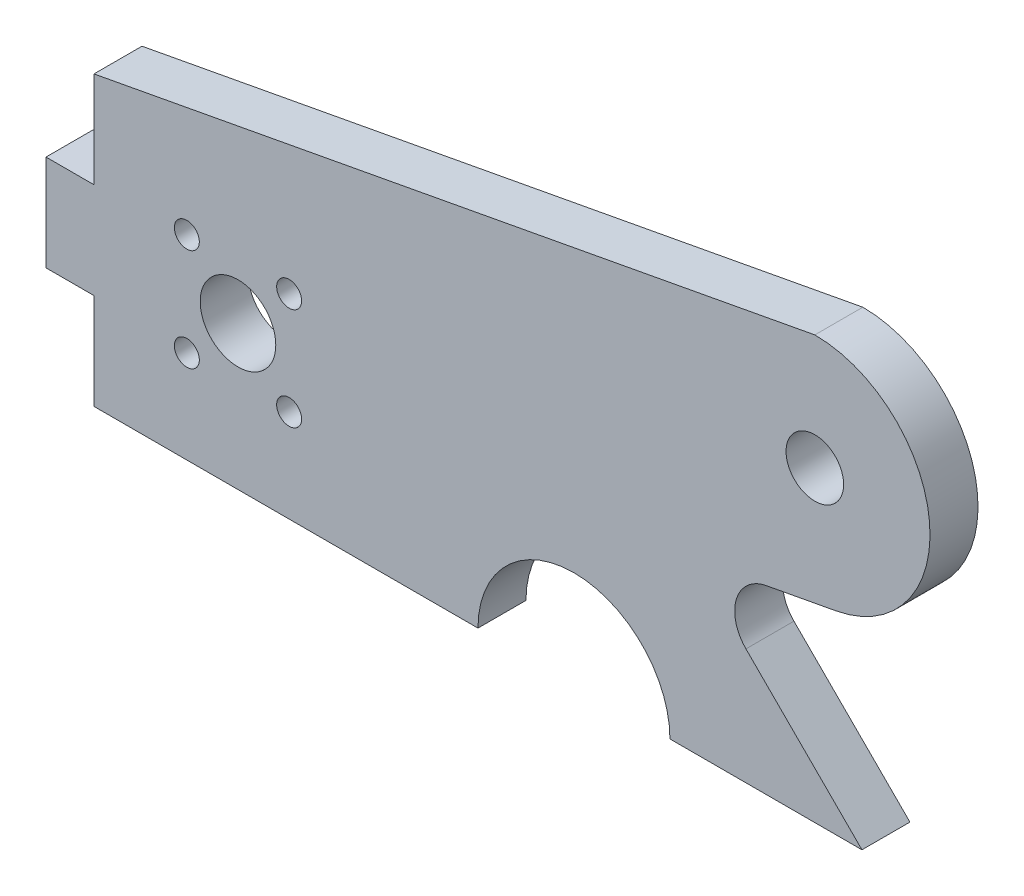
ISO-10303-21;
HEADER;
FILE_DESCRIPTION(('STEP AP214'),'2;1');
FILE_NAME('part.step','',(''),(''),'','','');
FILE_SCHEMA(('AUTOMOTIVE_DESIGN { 1 0 10303 214 1 1 1 1 }'));
ENDSEC;
DATA;
#1=APPLICATION_CONTEXT('core data for automotive mechanical design processes');
#2=APPLICATION_PROTOCOL_DEFINITION('international standard','automotive_design',2000,#1);
#3=PRODUCT_CONTEXT('',#1,'mechanical');
#4=PRODUCT('Part','Part','',(#3));
#5=PRODUCT_RELATED_PRODUCT_CATEGORY('part','',(#4));
#6=PRODUCT_DEFINITION_FORMATION('','',#4);
#7=PRODUCT_DEFINITION_CONTEXT('part definition',#1,'design');
#8=PRODUCT_DEFINITION('design','',#6,#7);
#9=PRODUCT_DEFINITION_SHAPE('','',#8);
#10=(LENGTH_UNIT() NAMED_UNIT(*) SI_UNIT(.MILLI.,.METRE.));
#11=(NAMED_UNIT(*) PLANE_ANGLE_UNIT() SI_UNIT($,.RADIAN.));
#12=(NAMED_UNIT(*) SI_UNIT($,.STERADIAN.) SOLID_ANGLE_UNIT());
#13=UNCERTAINTY_MEASURE_WITH_UNIT(LENGTH_MEASURE(1.E-05),#10,'distance_accuracy_value','');
#14=(GEOMETRIC_REPRESENTATION_CONTEXT(3) GLOBAL_UNCERTAINTY_ASSIGNED_CONTEXT((#13)) GLOBAL_UNIT_ASSIGNED_CONTEXT((#10,
#11,#12)) REPRESENTATION_CONTEXT('',''));
#15=CARTESIAN_POINT('',(0.,0.,0.));
#16=DIRECTION('',(0.,0.,1.));
#17=DIRECTION('',(1.,0.,0.));
#18=AXIS2_PLACEMENT_3D('',#15,#16,#17);
#19=CARTESIAN_POINT('',(0.,0.,6.35));
#20=DIRECTION('',(0.,1.,0.));
#21=DIRECTION('',(-1.,0.,0.));
#22=AXIS2_PLACEMENT_3D('',#19,#20,#21);
#23=PLANE('',#22);
#24=DIRECTION('',(1.,0.,0.));
#25=VECTOR('',#24,1.);
#26=CARTESIAN_POINT('',(0.,0.,0.));
#27=LINE('',#26,#25);
#28=CARTESIAN_POINT('',(0.,0.,0.));
#29=VERTEX_POINT('',#28);
#30=CARTESIAN_POINT('',(50.8,0.,0.));
#31=VERTEX_POINT('',#30);
#32=EDGE_CURVE('E142',#29,#31,#27,.T.);
#33=ORIENTED_EDGE('',*,*,#32,.T.);
#34=DIRECTION('',(0.,0.,1.));
#35=VECTOR('',#34,1.);
#36=CARTESIAN_POINT('',(50.8,0.,0.));
#37=LINE('',#36,#35);
#38=CARTESIAN_POINT('',(50.8,0.,6.35));
#39=VERTEX_POINT('',#38);
#40=EDGE_CURVE('E128',#31,#39,#37,.T.);
#41=ORIENTED_EDGE('',*,*,#40,.T.);
#42=DIRECTION('',(1.,0.,0.));
#43=VECTOR('',#42,1.);
#44=CARTESIAN_POINT('',(0.,0.,6.35));
#45=LINE('',#44,#43);
#46=CARTESIAN_POINT('',(0.,0.,6.35));
#47=VERTEX_POINT('',#46);
#48=EDGE_CURVE('E222',#47,#39,#45,.T.);
#49=ORIENTED_EDGE('',*,*,#48,.F.);
#50=DIRECTION('',(0.,0.,-1.));
#51=VECTOR('',#50,1.);
#52=CARTESIAN_POINT('',(0.,0.,6.35));
#53=LINE('',#52,#51);
#54=EDGE_CURVE('E148',#47,#29,#53,.T.);
#55=ORIENTED_EDGE('',*,*,#54,.T.);
#56=EDGE_LOOP('',(#33,#41,#49,#55));
#57=FACE_BOUND('',#56,.T.);
#58=ADVANCED_FACE('F34',(#57),#23,.F.);
#59=CARTESIAN_POINT('',(95.3674532925549,40.64,6.35));
#60=DIRECTION('',(0.,0.,1.));
#61=DIRECTION('',(1.,0.,0.));
#62=AXIS2_PLACEMENT_3D('',#59,#60,#61);
#63=PLANE('',#62);
#64=CARTESIAN_POINT('',(19.05,19.05,6.35));
#65=DIRECTION('',(0.,0.,1.));
#66=DIRECTION('',(1.,0.,0.));
#67=AXIS2_PLACEMENT_3D('',#64,#65,#66);
#68=CIRCLE('',#67,5.000000033);
#69=CARTESIAN_POINT('',(24.050000033,19.05,6.35));
#70=VERTEX_POINT('',#69);
#71=EDGE_CURVE('E458',#70,#70,#68,.T.);
#72=ORIENTED_EDGE('',*,*,#71,.F.);
#73=EDGE_LOOP('',(#72));
#74=FACE_BOUND('',#73,.T.);
#75=CARTESIAN_POINT('',(63.5,0.,6.35));
#76=DIRECTION('',(0.,0.,1.));
#77=DIRECTION('',(1.,0.,0.));
#78=AXIS2_PLACEMENT_3D('',#75,#76,#77);
#79=CIRCLE('',#78,12.7);
#80=CARTESIAN_POINT('',(76.2,0.,6.35));
#81=VERTEX_POINT('',#80);
#82=EDGE_CURVE('E131',#81,#39,#79,.T.);
#83=ORIENTED_EDGE('',*,*,#82,.F.);
#84=CARTESIAN_POINT('',(101.6,0.,6.35));
#85=VERTEX_POINT('',#84);
#86=EDGE_CURVE('E243',#81,#85,#45,.T.);
#87=ORIENTED_EDGE('',*,*,#86,.T.);
#88=DIRECTION('',(-0.707106781186551,0.707106781186544,0.));
#89=VECTOR('',#88,1.);
#90=CARTESIAN_POINT('',(101.6,0.,6.35));
#91=LINE('',#90,#89);
#92=CARTESIAN_POINT('',(86.2519913059842,15.3480086940156,6.35));
#93=VERTEX_POINT('',#92);
#94=EDGE_CURVE('E214',#85,#93,#91,.T.);
#95=ORIENTED_EDGE('',*,*,#94,.T.);
#96=CARTESIAN_POINT('',(89.8440937544119,18.9401111424433,6.35));
#97=DIRECTION('',(0.,0.,1.));
#98=DIRECTION('',(1.,0.,0.));
#99=AXIS2_PLACEMENT_3D('',#96,#97,#98);
#100=CIRCLE('',#99,5.08);
#101=CARTESIAN_POINT('',(88.913037875358,23.934060977001,6.35));
#102=VERTEX_POINT('',#101);
#103=EDGE_CURVE('E11',#93,#102,#100,.F.);
#104=ORIENTED_EDGE('',*,*,#103,.T.);
#105=DIRECTION('',(0.983060991054671,0.183278716349196,0.));
#106=VECTOR('',#105,1.);
#107=CARTESIAN_POINT('',(79.4333090501251,22.1666909498746,6.35));
#108=LINE('',#107,#106);
#109=CARTESIAN_POINT('',(98.1606209297166,25.6581504963268,6.35));
#110=VERTEX_POINT('',#109);
#111=EDGE_CURVE('E212',#102,#110,#108,.T.);
#112=ORIENTED_EDGE('',*,*,#111,.T.);
#113=CARTESIAN_POINT('',(95.3674532925549,40.64,6.35));
#114=DIRECTION('',(0.,0.,1.));
#115=DIRECTION('',(1.,0.,0.));
#116=AXIS2_PLACEMENT_3D('',#113,#114,#115);
#117=CIRCLE('',#116,15.24);
#118=CARTESIAN_POINT('',(95.3674532925549,55.88,6.35));
#119=VERTEX_POINT('',#118);
#120=EDGE_CURVE('E218',#110,#119,#117,.T.);
#121=ORIENTED_EDGE('',*,*,#120,.T.);
#122=DIRECTION('',(-0.983060991054669,-0.183278716349203,0.));
#123=VECTOR('',#122,1.);
#124=CARTESIAN_POINT('',(95.3674532925549,55.88,6.35));
#125=LINE('',#124,#123);
#126=CARTESIAN_POINT('',(0.,38.1,6.35));
#127=VERTEX_POINT('',#126);
#128=EDGE_CURVE('E220',#119,#127,#125,.T.);
#129=ORIENTED_EDGE('',*,*,#128,.T.);
#130=DIRECTION('',(0.,-1.,0.));
#131=VECTOR('',#130,1.);
#132=CARTESIAN_POINT('',(0.,38.1,6.35));
#133=LINE('',#132,#131);
#134=CARTESIAN_POINT('',(0.,25.4,6.35));
#135=VERTEX_POINT('',#134);
#136=EDGE_CURVE('E227',#127,#135,#133,.T.);
#137=ORIENTED_EDGE('',*,*,#136,.T.);
#138=DIRECTION('',(-1.,0.,0.));
#139=VECTOR('',#138,1.);
#140=CARTESIAN_POINT('',(0.,25.4,6.35));
#141=LINE('',#140,#139);
#142=CARTESIAN_POINT('',(-6.35,25.4,6.35));
#143=VERTEX_POINT('',#142);
#144=EDGE_CURVE('E229',#135,#143,#141,.T.);
#145=ORIENTED_EDGE('',*,*,#144,.T.);
#146=DIRECTION('',(0.,-1.,0.));
#147=VECTOR('',#146,1.);
#148=CARTESIAN_POINT('',(-6.35,25.4,6.35));
#149=LINE('',#148,#147);
#150=CARTESIAN_POINT('',(-6.35,12.7,6.35));
#151=VERTEX_POINT('',#150);
#152=EDGE_CURVE('E231',#143,#151,#149,.T.);
#153=ORIENTED_EDGE('',*,*,#152,.T.);
#154=DIRECTION('',(1.,0.,0.));
#155=VECTOR('',#154,1.);
#156=CARTESIAN_POINT('',(0.,12.7,6.35));
#157=LINE('',#156,#155);
#158=CARTESIAN_POINT('',(0.,12.7,6.35));
#159=VERTEX_POINT('',#158);
#160=EDGE_CURVE('E176',#151,#159,#157,.T.);
#161=ORIENTED_EDGE('',*,*,#160,.T.);
#162=DIRECTION('',(0.,-1.,0.));
#163=VECTOR('',#162,1.);
#164=CARTESIAN_POINT('',(0.,12.7,6.35));
#165=LINE('',#164,#163);
#166=EDGE_CURVE('E171',#159,#47,#165,.T.);
#167=ORIENTED_EDGE('',*,*,#166,.T.);
#168=ORIENTED_EDGE('',*,*,#48,.T.);
#169=EDGE_LOOP('',(#83,#87,#95,#104,#112,#121,#129,#137,#145,#153,#161,#167,#168));
#170=FACE_BOUND('',#169,.T.);
#171=CARTESIAN_POINT('',(12.2829881040447,12.2829881040447,6.35));
#172=DIRECTION('',(0.,0.,1.));
#173=DIRECTION('',(1.,0.,0.));
#174=AXIS2_PLACEMENT_3D('',#171,#172,#173);
#175=CIRCLE('',#174,1.65099999999998);
#176=CARTESIAN_POINT('',(13.9339881040447,12.2829881040447,6.35));
#177=VERTEX_POINT('',#176);
#178=EDGE_CURVE('E274',#177,#177,#175,.T.);
#179=ORIENTED_EDGE('',*,*,#178,.F.);
#180=EDGE_LOOP('',(#179));
#181=FACE_BOUND('',#180,.T.);
#182=CARTESIAN_POINT('',(25.8170118959553,25.8170118959552,6.35));
#183=DIRECTION('',(0.,0.,1.));
#184=DIRECTION('',(1.,0.,0.));
#185=AXIS2_PLACEMENT_3D('',#182,#183,#184);
#186=CIRCLE('',#185,1.65099999999998);
#187=CARTESIAN_POINT('',(27.4680118959552,25.8170118959552,6.35));
#188=VERTEX_POINT('',#187);
#189=EDGE_CURVE('E286',#188,#188,#186,.T.);
#190=ORIENTED_EDGE('',*,*,#189,.F.);
#191=EDGE_LOOP('',(#190));
#192=FACE_BOUND('',#191,.T.);
#193=CARTESIAN_POINT('',(95.3674532925549,40.64,6.35));
#194=DIRECTION('',(0.,0.,1.));
#195=DIRECTION('',(1.,0.,0.));
#196=AXIS2_PLACEMENT_3D('',#193,#194,#195);
#197=CIRCLE('',#196,3.81000000000002);
#198=CARTESIAN_POINT('',(99.1774532925549,40.64,6.35));
#199=VERTEX_POINT('',#198);
#200=EDGE_CURVE('E290',#199,#199,#197,.T.);
#201=ORIENTED_EDGE('',*,*,#200,.F.);
#202=EDGE_LOOP('',(#201));
#203=FACE_BOUND('',#202,.T.);
#204=CARTESIAN_POINT('',(25.8170118959553,12.2829881040447,6.35));
#205=DIRECTION('',(0.,0.,1.));
#206=DIRECTION('',(1.,0.,0.));
#207=AXIS2_PLACEMENT_3D('',#204,#205,#206);
#208=CIRCLE('',#207,1.65099999999998);
#209=CARTESIAN_POINT('',(27.4680118959552,12.2829881040447,6.35));
#210=VERTEX_POINT('',#209);
#211=EDGE_CURVE('E280',#210,#210,#208,.T.);
#212=ORIENTED_EDGE('',*,*,#211,.F.);
#213=EDGE_LOOP('',(#212));
#214=FACE_BOUND('',#213,.T.);
#215=CARTESIAN_POINT('',(12.2829881040448,25.8170118959553,6.35));
#216=DIRECTION('',(0.,0.,1.));
#217=DIRECTION('',(1.,0.,0.));
#218=AXIS2_PLACEMENT_3D('',#215,#216,#217);
#219=CIRCLE('',#218,1.65099999999999);
#220=CARTESIAN_POINT('',(13.9339881040447,25.8170118959553,6.35));
#221=VERTEX_POINT('',#220);
#222=EDGE_CURVE('E268',#221,#221,#219,.T.);
#223=ORIENTED_EDGE('',*,*,#222,.F.);
#224=EDGE_LOOP('',(#223));
#225=FACE_BOUND('',#224,.T.);
#226=ADVANCED_FACE('F210',(#74,#170,#181,#192,#203,#214,#225),#63,.T.);
#227=CARTESIAN_POINT('',(95.3674532925549,40.64,0.));
#228=DIRECTION('',(0.,0.,1.));
#229=DIRECTION('',(1.,0.,0.));
#230=AXIS2_PLACEMENT_3D('',#227,#228,#229);
#231=PLANE('',#230);
#232=CARTESIAN_POINT('',(19.05,19.05,0.));
#233=DIRECTION('',(0.,0.,1.));
#234=DIRECTION('',(1.,0.,0.));
#235=AXIS2_PLACEMENT_3D('',#232,#233,#234);
#236=CIRCLE('',#235,5.000000033);
#237=CARTESIAN_POINT('',(24.050000033,19.05,0.));
#238=VERTEX_POINT('',#237);
#239=EDGE_CURVE('E249',#238,#238,#236,.T.);
#240=ORIENTED_EDGE('',*,*,#239,.T.);
#241=EDGE_LOOP('',(#240));
#242=FACE_BOUND('',#241,.T.);
#243=CARTESIAN_POINT('',(76.2,0.,0.));
#244=VERTEX_POINT('',#243);
#245=CARTESIAN_POINT('',(101.6,0.,0.));
#246=VERTEX_POINT('',#245);
#247=EDGE_CURVE('E145',#244,#246,#27,.T.);
#248=ORIENTED_EDGE('',*,*,#247,.F.);
#249=CARTESIAN_POINT('',(63.5,0.,0.));
#250=DIRECTION('',(0.,0.,1.));
#251=DIRECTION('',(1.,0.,0.));
#252=AXIS2_PLACEMENT_3D('',#249,#250,#251);
#253=CIRCLE('',#252,12.7);
#254=EDGE_CURVE('E49',#244,#31,#253,.T.);
#255=ORIENTED_EDGE('',*,*,#254,.T.);
#256=ORIENTED_EDGE('',*,*,#32,.F.);
#257=DIRECTION('',(0.,-1.,0.));
#258=VECTOR('',#257,1.);
#259=CARTESIAN_POINT('',(0.,12.7,0.));
#260=LINE('',#259,#258);
#261=CARTESIAN_POINT('',(0.,12.7,0.));
#262=VERTEX_POINT('',#261);
#263=EDGE_CURVE('E154',#262,#29,#260,.T.);
#264=ORIENTED_EDGE('',*,*,#263,.F.);
#265=DIRECTION('',(1.,0.,0.));
#266=VECTOR('',#265,1.);
#267=CARTESIAN_POINT('',(0.,12.7,0.));
#268=LINE('',#267,#266);
#269=CARTESIAN_POINT('',(-6.35,12.7,0.));
#270=VERTEX_POINT('',#269);
#271=EDGE_CURVE('E169',#270,#262,#268,.T.);
#272=ORIENTED_EDGE('',*,*,#271,.F.);
#273=DIRECTION('',(0.,-1.,0.));
#274=VECTOR('',#273,1.);
#275=CARTESIAN_POINT('',(-6.35,25.4,0.));
#276=LINE('',#275,#274);
#277=CARTESIAN_POINT('',(-6.35,25.4,0.));
#278=VERTEX_POINT('',#277);
#279=EDGE_CURVE('E167',#278,#270,#276,.T.);
#280=ORIENTED_EDGE('',*,*,#279,.F.);
#281=DIRECTION('',(-1.,0.,0.));
#282=VECTOR('',#281,1.);
#283=CARTESIAN_POINT('',(0.,25.4,0.));
#284=LINE('',#283,#282);
#285=CARTESIAN_POINT('',(0.,25.4,0.));
#286=VERTEX_POINT('',#285);
#287=EDGE_CURVE('E165',#286,#278,#284,.T.);
#288=ORIENTED_EDGE('',*,*,#287,.F.);
#289=DIRECTION('',(0.,-1.,0.));
#290=VECTOR('',#289,1.);
#291=CARTESIAN_POINT('',(0.,38.1,0.));
#292=LINE('',#291,#290);
#293=CARTESIAN_POINT('',(0.,38.1,0.));
#294=VERTEX_POINT('',#293);
#295=EDGE_CURVE('E163',#294,#286,#292,.T.);
#296=ORIENTED_EDGE('',*,*,#295,.F.);
#297=DIRECTION('',(-0.983060991054669,-0.183278716349203,0.));
#298=VECTOR('',#297,1.);
#299=CARTESIAN_POINT('',(95.3674532925549,55.88,0.));
#300=LINE('',#299,#298);
#301=CARTESIAN_POINT('',(95.3674532925549,55.88,0.));
#302=VERTEX_POINT('',#301);
#303=EDGE_CURVE('E161',#302,#294,#300,.T.);
#304=ORIENTED_EDGE('',*,*,#303,.F.);
#305=CARTESIAN_POINT('',(95.3674532925549,40.64,0.));
#306=DIRECTION('',(0.,0.,1.));
#307=DIRECTION('',(1.,0.,0.));
#308=AXIS2_PLACEMENT_3D('',#305,#306,#307);
#309=CIRCLE('',#308,15.24);
#310=CARTESIAN_POINT('',(98.1606209297166,25.6581504963268,0.));
#311=VERTEX_POINT('',#310);
#312=EDGE_CURVE('E159',#311,#302,#309,.T.);
#313=ORIENTED_EDGE('',*,*,#312,.F.);
#314=DIRECTION('',(0.983060991054671,0.183278716349196,0.));
#315=VECTOR('',#314,1.);
#316=CARTESIAN_POINT('',(79.4333090501251,22.1666909498746,0.));
#317=LINE('',#316,#315);
#318=CARTESIAN_POINT('',(88.913037875358,23.934060977001,0.));
#319=VERTEX_POINT('',#318);
#320=EDGE_CURVE('E152',#319,#311,#317,.T.);
#321=ORIENTED_EDGE('',*,*,#320,.F.);
#322=CARTESIAN_POINT('',(89.8440937544119,18.9401111424433,0.));
#323=DIRECTION('',(0.,0.,1.));
#324=DIRECTION('',(1.,0.,0.));
#325=AXIS2_PLACEMENT_3D('',#322,#323,#324);
#326=CIRCLE('',#325,5.08);
#327=CARTESIAN_POINT('',(86.2519913059842,15.3480086940156,0.));
#328=VERTEX_POINT('',#327);
#329=EDGE_CURVE('E42',#319,#328,#326,.T.);
#330=ORIENTED_EDGE('',*,*,#329,.T.);
#331=DIRECTION('',(-0.707106781186551,0.707106781186544,0.));
#332=VECTOR('',#331,1.);
#333=CARTESIAN_POINT('',(101.6,0.,0.));
#334=LINE('',#333,#332);
#335=EDGE_CURVE('E150',#246,#328,#334,.T.);
#336=ORIENTED_EDGE('',*,*,#335,.F.);
#337=EDGE_LOOP('',(#248,#255,#256,#264,#272,#280,#288,#296,#304,#313,#321,#330,#336));
#338=FACE_BOUND('',#337,.T.);
#339=CARTESIAN_POINT('',(95.3674532925549,40.64,0.));
#340=DIRECTION('',(0.,0.,1.));
#341=DIRECTION('',(1.,0.,0.));
#342=AXIS2_PLACEMENT_3D('',#339,#340,#341);
#343=CIRCLE('',#342,3.81000000000002);
#344=CARTESIAN_POINT('',(99.1774532925549,40.64,0.));
#345=VERTEX_POINT('',#344);
#346=EDGE_CURVE('E246',#345,#345,#343,.T.);
#347=ORIENTED_EDGE('',*,*,#346,.T.);
#348=EDGE_LOOP('',(#347));
#349=FACE_BOUND('',#348,.T.);
#350=CARTESIAN_POINT('',(25.8170118959553,25.8170118959552,0.));
#351=DIRECTION('',(0.,0.,1.));
#352=DIRECTION('',(1.,0.,0.));
#353=AXIS2_PLACEMENT_3D('',#350,#351,#352);
#354=CIRCLE('',#353,1.65099999999998);
#355=CARTESIAN_POINT('',(27.4680118959552,25.8170118959552,0.));
#356=VERTEX_POINT('',#355);
#357=EDGE_CURVE('E283',#356,#356,#354,.T.);
#358=ORIENTED_EDGE('',*,*,#357,.T.);
#359=EDGE_LOOP('',(#358));
#360=FACE_BOUND('',#359,.T.);
#361=CARTESIAN_POINT('',(25.8170118959553,12.2829881040447,0.));
#362=DIRECTION('',(0.,0.,1.));
#363=DIRECTION('',(1.,0.,0.));
#364=AXIS2_PLACEMENT_3D('',#361,#362,#363);
#365=CIRCLE('',#364,1.65099999999998);
#366=CARTESIAN_POINT('',(27.4680118959552,12.2829881040447,0.));
#367=VERTEX_POINT('',#366);
#368=EDGE_CURVE('E277',#367,#367,#365,.T.);
#369=ORIENTED_EDGE('',*,*,#368,.T.);
#370=EDGE_LOOP('',(#369));
#371=FACE_BOUND('',#370,.T.);
#372=CARTESIAN_POINT('',(12.2829881040447,12.2829881040447,0.));
#373=DIRECTION('',(0.,0.,1.));
#374=DIRECTION('',(1.,0.,0.));
#375=AXIS2_PLACEMENT_3D('',#372,#373,#374);
#376=CIRCLE('',#375,1.65099999999998);
#377=CARTESIAN_POINT('',(13.9339881040447,12.2829881040447,0.));
#378=VERTEX_POINT('',#377);
#379=EDGE_CURVE('E271',#378,#378,#376,.T.);
#380=ORIENTED_EDGE('',*,*,#379,.T.);
#381=EDGE_LOOP('',(#380));
#382=FACE_BOUND('',#381,.T.);
#383=CARTESIAN_POINT('',(12.2829881040448,25.8170118959553,0.));
#384=DIRECTION('',(0.,0.,1.));
#385=DIRECTION('',(1.,0.,0.));
#386=AXIS2_PLACEMENT_3D('',#383,#384,#385);
#387=CIRCLE('',#386,1.65099999999999);
#388=CARTESIAN_POINT('',(13.9339881040447,25.8170118959553,0.));
#389=VERTEX_POINT('',#388);
#390=EDGE_CURVE('E262',#389,#389,#387,.T.);
#391=ORIENTED_EDGE('',*,*,#390,.T.);
#392=EDGE_LOOP('',(#391));
#393=FACE_BOUND('',#392,.T.);
#394=ADVANCED_FACE('F139',(#242,#338,#349,#360,#371,#382,#393),#231,.F.);
#395=CARTESIAN_POINT('',(0.,12.7,6.35));
#396=DIRECTION('',(1.,0.,0.));
#397=DIRECTION('',(0.,1.,0.));
#398=AXIS2_PLACEMENT_3D('',#395,#396,#397);
#399=PLANE('',#398);
#400=CARTESIAN_POINT('',(0.,6.35,3.175));
#401=DIRECTION('',(-1.,0.,0.));
#402=DIRECTION('',(0.,-1.,0.));
#403=AXIS2_PLACEMENT_3D('',#400,#401,#402);
#404=CIRCLE('',#403,1.5875);
#405=CARTESIAN_POINT('',(0.,4.7625,3.175));
#406=VERTEX_POINT('',#405);
#407=EDGE_CURVE('E253',#406,#406,#404,.T.);
#408=ORIENTED_EDGE('',*,*,#407,.F.);
#409=EDGE_LOOP('',(#408));
#410=FACE_BOUND('',#409,.T.);
#411=ORIENTED_EDGE('',*,*,#263,.T.);
#412=ORIENTED_EDGE('',*,*,#54,.F.);
#413=ORIENTED_EDGE('',*,*,#166,.F.);
#414=DIRECTION('',(0.,0.,-1.));
#415=VECTOR('',#414,1.);
#416=CARTESIAN_POINT('',(0.,12.7,6.35));
#417=LINE('',#416,#415);
#418=EDGE_CURVE('E172',#159,#262,#417,.T.);
#419=ORIENTED_EDGE('',*,*,#418,.T.);
#420=EDGE_LOOP('',(#411,#412,#413,#419));
#421=FACE_BOUND('',#420,.T.);
#422=ADVANCED_FACE('F242',(#410,#421),#399,.F.);
#423=ORIENTED_EDGE('',*,*,#86,.F.);
#424=DIRECTION('',(0.,0.,1.));
#425=VECTOR('',#424,1.);
#426=CARTESIAN_POINT('',(76.2,0.,0.));
#427=LINE('',#426,#425);
#428=EDGE_CURVE('E135',#244,#81,#427,.T.);
#429=ORIENTED_EDGE('',*,*,#428,.F.);
#430=ORIENTED_EDGE('',*,*,#247,.T.);
#431=DIRECTION('',(0.,0.,-1.));
#432=VECTOR('',#431,1.);
#433=CARTESIAN_POINT('',(101.6,0.,6.35));
#434=LINE('',#433,#432);
#435=EDGE_CURVE('E194',#85,#246,#434,.T.);
#436=ORIENTED_EDGE('',*,*,#435,.F.);
#437=EDGE_LOOP('',(#423,#429,#430,#436));
#438=FACE_BOUND('',#437,.T.);
#439=ADVANCED_FACE('F252',(#438),#23,.F.);
#440=CARTESIAN_POINT('',(101.6,0.,6.35));
#441=DIRECTION('',(-0.707106781186544,-0.707106781186551,0.));
#442=DIRECTION('',(0.707106781186551,-0.707106781186544,0.));
#443=AXIS2_PLACEMENT_3D('',#440,#441,#442);
#444=PLANE('',#443);
#445=ORIENTED_EDGE('',*,*,#335,.T.);
#446=DIRECTION('',(0.,0.,-1.));
#447=VECTOR('',#446,1.);
#448=CARTESIAN_POINT('',(86.2519913059842,15.3480086940156,6.35));
#449=LINE('',#448,#447);
#450=EDGE_CURVE('E57',#328,#93,#449,.F.);
#451=ORIENTED_EDGE('',*,*,#450,.T.);
#452=ORIENTED_EDGE('',*,*,#94,.F.);
#453=ORIENTED_EDGE('',*,*,#435,.T.);
#454=EDGE_LOOP('',(#445,#451,#452,#453));
#455=FACE_BOUND('',#454,.T.);
#456=ADVANCED_FACE('F205',(#455),#444,.F.);
#457=CARTESIAN_POINT('',(79.4333090501251,22.1666909498746,6.35));
#458=DIRECTION('',(-0.183278716349196,0.98306099105467,0.));
#459=DIRECTION('',(-0.98306099105467,-0.183278716349196,0.));
#460=AXIS2_PLACEMENT_3D('',#457,#458,#459);
#461=PLANE('',#460);
#462=ORIENTED_EDGE('',*,*,#111,.F.);
#463=DIRECTION('',(0.,0.,-1.));
#464=VECTOR('',#463,1.);
#465=CARTESIAN_POINT('',(88.913037875358,23.934060977001,0.));
#466=LINE('',#465,#464);
#467=EDGE_CURVE('E198',#102,#319,#466,.T.);
#468=ORIENTED_EDGE('',*,*,#467,.T.);
#469=ORIENTED_EDGE('',*,*,#320,.T.);
#470=DIRECTION('',(0.,0.,-1.));
#471=VECTOR('',#470,1.);
#472=CARTESIAN_POINT('',(98.1606209297166,25.6581504963268,6.35));
#473=LINE('',#472,#471);
#474=EDGE_CURVE('E191',#110,#311,#473,.T.);
#475=ORIENTED_EDGE('',*,*,#474,.F.);
#476=EDGE_LOOP('',(#462,#468,#469,#475));
#477=FACE_BOUND('',#476,.T.);
#478=ADVANCED_FACE('F216',(#477),#461,.F.);
#479=CARTESIAN_POINT('',(95.3674532925549,40.64,6.35));
#480=DIRECTION('',(0.,0.,-1.));
#481=DIRECTION('',(-1.,0.,0.));
#482=AXIS2_PLACEMENT_3D('',#479,#480,#481);
#483=CYLINDRICAL_SURFACE('',#482,15.24);
#484=ORIENTED_EDGE('',*,*,#312,.T.);
#485=DIRECTION('',(0.,0.,-1.));
#486=VECTOR('',#485,1.);
#487=CARTESIAN_POINT('',(95.3674532925549,55.88,6.35));
#488=LINE('',#487,#486);
#489=EDGE_CURVE('E188',#119,#302,#488,.T.);
#490=ORIENTED_EDGE('',*,*,#489,.F.);
#491=ORIENTED_EDGE('',*,*,#120,.F.);
#492=ORIENTED_EDGE('',*,*,#474,.T.);
#493=EDGE_LOOP('',(#484,#490,#491,#492));
#494=FACE_BOUND('',#493,.T.);
#495=ADVANCED_FACE('F528',(#494),#483,.T.);
#496=CARTESIAN_POINT('',(95.3674532925549,55.88,6.35));
#497=DIRECTION('',(0.183278716349203,-0.983060991054669,0.));
#498=DIRECTION('',(0.983060991054669,0.183278716349203,0.));
#499=AXIS2_PLACEMENT_3D('',#496,#497,#498);
#500=PLANE('',#499);
#501=ORIENTED_EDGE('',*,*,#303,.T.);
#502=DIRECTION('',(0.,0.,-1.));
#503=VECTOR('',#502,1.);
#504=CARTESIAN_POINT('',(0.,38.1,6.35));
#505=LINE('',#504,#503);
#506=EDGE_CURVE('E185',#127,#294,#505,.T.);
#507=ORIENTED_EDGE('',*,*,#506,.F.);
#508=ORIENTED_EDGE('',*,*,#128,.F.);
#509=ORIENTED_EDGE('',*,*,#489,.T.);
#510=EDGE_LOOP('',(#501,#507,#508,#509));
#511=FACE_BOUND('',#510,.T.);
#512=ADVANCED_FACE('F473',(#511),#500,.F.);
#513=CARTESIAN_POINT('',(0.,38.1,6.35));
#514=DIRECTION('',(1.,0.,0.));
#515=DIRECTION('',(0.,1.,0.));
#516=AXIS2_PLACEMENT_3D('',#513,#514,#515);
#517=PLANE('',#516);
#518=CARTESIAN_POINT('',(0.,31.75,3.175));
#519=DIRECTION('',(-1.,0.,0.));
#520=DIRECTION('',(0.,-1.,0.));
#521=AXIS2_PLACEMENT_3D('',#518,#519,#520);
#522=CIRCLE('',#521,1.5875);
#523=CARTESIAN_POINT('',(0.,30.1625,3.175));
#524=VERTEX_POINT('',#523);
#525=EDGE_CURVE('E263',#524,#524,#522,.T.);
#526=ORIENTED_EDGE('',*,*,#525,.F.);
#527=EDGE_LOOP('',(#526));
#528=FACE_BOUND('',#527,.T.);
#529=ORIENTED_EDGE('',*,*,#295,.T.);
#530=DIRECTION('',(0.,0.,-1.));
#531=VECTOR('',#530,1.);
#532=CARTESIAN_POINT('',(0.,25.4,6.35));
#533=LINE('',#532,#531);
#534=EDGE_CURVE('E182',#135,#286,#533,.T.);
#535=ORIENTED_EDGE('',*,*,#534,.F.);
#536=ORIENTED_EDGE('',*,*,#136,.F.);
#537=ORIENTED_EDGE('',*,*,#506,.T.);
#538=EDGE_LOOP('',(#529,#535,#536,#537));
#539=FACE_BOUND('',#538,.T.);
#540=ADVANCED_FACE('F468',(#528,#539),#517,.F.);
#541=CARTESIAN_POINT('',(0.,25.4,6.35));
#542=DIRECTION('',(0.,-1.,0.));
#543=DIRECTION('',(0.,0.,-1.));
#544=AXIS2_PLACEMENT_3D('',#541,#542,#543);
#545=PLANE('',#544);
#546=ORIENTED_EDGE('',*,*,#287,.T.);
#547=DIRECTION('',(0.,0.,-1.));
#548=VECTOR('',#547,1.);
#549=CARTESIAN_POINT('',(-6.35,25.4,6.35));
#550=LINE('',#549,#548);
#551=EDGE_CURVE('E179',#143,#278,#550,.T.);
#552=ORIENTED_EDGE('',*,*,#551,.F.);
#553=ORIENTED_EDGE('',*,*,#144,.F.);
#554=ORIENTED_EDGE('',*,*,#534,.T.);
#555=EDGE_LOOP('',(#546,#552,#553,#554));
#556=FACE_BOUND('',#555,.T.);
#557=ADVANCED_FACE('F472',(#556),#545,.F.);
#558=CARTESIAN_POINT('',(-6.35,25.4,6.35));
#559=DIRECTION('',(1.,0.,0.));
#560=DIRECTION('',(0.,1.,0.));
#561=AXIS2_PLACEMENT_3D('',#558,#559,#560);
#562=PLANE('',#561);
#563=ORIENTED_EDGE('',*,*,#279,.T.);
#564=DIRECTION('',(0.,0.,-1.));
#565=VECTOR('',#564,1.);
#566=CARTESIAN_POINT('',(-6.35,12.7,6.35));
#567=LINE('',#566,#565);
#568=EDGE_CURVE('E175',#151,#270,#567,.T.);
#569=ORIENTED_EDGE('',*,*,#568,.F.);
#570=ORIENTED_EDGE('',*,*,#152,.F.);
#571=ORIENTED_EDGE('',*,*,#551,.T.);
#572=EDGE_LOOP('',(#563,#569,#570,#571));
#573=FACE_BOUND('',#572,.T.);
#574=ADVANCED_FACE('F309',(#573),#562,.F.);
#575=CARTESIAN_POINT('',(0.,12.7,6.35));
#576=DIRECTION('',(0.,1.,0.));
#577=DIRECTION('',(0.,0.,1.));
#578=AXIS2_PLACEMENT_3D('',#575,#576,#577);
#579=PLANE('',#578);
#580=ORIENTED_EDGE('',*,*,#271,.T.);
#581=ORIENTED_EDGE('',*,*,#418,.F.);
#582=ORIENTED_EDGE('',*,*,#160,.F.);
#583=ORIENTED_EDGE('',*,*,#568,.T.);
#584=EDGE_LOOP('',(#580,#581,#582,#583));
#585=FACE_BOUND('',#584,.T.);
#586=ADVANCED_FACE('F239',(#585),#579,.F.);
#587=CARTESIAN_POINT('',(95.3674532925549,40.64,6.35));
#588=DIRECTION('',(0.,0.,-1.));
#589=DIRECTION('',(-1.,0.,0.));
#590=AXIS2_PLACEMENT_3D('',#587,#588,#589);
#591=CYLINDRICAL_SURFACE('',#590,3.81000000000002);
#592=ORIENTED_EDGE('',*,*,#200,.T.);
#593=EDGE_LOOP('',(#592));
#594=FACE_BOUND('',#593,.T.);
#595=ORIENTED_EDGE('',*,*,#346,.F.);
#596=EDGE_LOOP('',(#595));
#597=FACE_BOUND('',#596,.T.);
#598=ADVANCED_FACE('F298',(#594,#597),#591,.F.);
#599=CARTESIAN_POINT('',(25.8170118959553,25.8170118959552,6.35));
#600=DIRECTION('',(0.,0.,-1.));
#601=DIRECTION('',(-1.,0.,0.));
#602=AXIS2_PLACEMENT_3D('',#599,#600,#601);
#603=CYLINDRICAL_SURFACE('',#602,1.65099999999998);
#604=ORIENTED_EDGE('',*,*,#189,.T.);
#605=EDGE_LOOP('',(#604));
#606=FACE_BOUND('',#605,.T.);
#607=ORIENTED_EDGE('',*,*,#357,.F.);
#608=EDGE_LOOP('',(#607));
#609=FACE_BOUND('',#608,.T.);
#610=ADVANCED_FACE('F300',(#606,#609),#603,.F.);
#611=CARTESIAN_POINT('',(25.8170118959553,12.2829881040447,6.35));
#612=DIRECTION('',(0.,0.,-1.));
#613=DIRECTION('',(-1.,0.,0.));
#614=AXIS2_PLACEMENT_3D('',#611,#612,#613);
#615=CYLINDRICAL_SURFACE('',#614,1.65099999999998);
#616=ORIENTED_EDGE('',*,*,#211,.T.);
#617=EDGE_LOOP('',(#616));
#618=FACE_BOUND('',#617,.T.);
#619=ORIENTED_EDGE('',*,*,#368,.F.);
#620=EDGE_LOOP('',(#619));
#621=FACE_BOUND('',#620,.T.);
#622=ADVANCED_FACE('F306',(#618,#621),#615,.F.);
#623=CARTESIAN_POINT('',(12.2829881040447,12.2829881040447,6.35));
#624=DIRECTION('',(0.,0.,-1.));
#625=DIRECTION('',(-1.,0.,0.));
#626=AXIS2_PLACEMENT_3D('',#623,#624,#625);
#627=CYLINDRICAL_SURFACE('',#626,1.65099999999998);
#628=ORIENTED_EDGE('',*,*,#178,.T.);
#629=EDGE_LOOP('',(#628));
#630=FACE_BOUND('',#629,.T.);
#631=ORIENTED_EDGE('',*,*,#379,.F.);
#632=EDGE_LOOP('',(#631));
#633=FACE_BOUND('',#632,.T.);
#634=ADVANCED_FACE('F355',(#630,#633),#627,.F.);
#635=CARTESIAN_POINT('',(12.2829881040448,25.8170118959553,6.35));
#636=DIRECTION('',(0.,0.,-1.));
#637=DIRECTION('',(-1.,0.,0.));
#638=AXIS2_PLACEMENT_3D('',#635,#636,#637);
#639=CYLINDRICAL_SURFACE('',#638,1.65099999999999);
#640=ORIENTED_EDGE('',*,*,#222,.T.);
#641=EDGE_LOOP('',(#640));
#642=FACE_BOUND('',#641,.T.);
#643=ORIENTED_EDGE('',*,*,#390,.F.);
#644=EDGE_LOOP('',(#643));
#645=FACE_BOUND('',#644,.T.);
#646=ADVANCED_FACE('F352',(#642,#645),#639,.F.);
#647=CARTESIAN_POINT('',(89.8440937544119,18.9401111424433,6.35));
#648=DIRECTION('',(0.,0.,1.));
#649=DIRECTION('',(1.,0.,0.));
#650=AXIS2_PLACEMENT_3D('',#647,#648,#649);
#651=CYLINDRICAL_SURFACE('',#650,5.08);
#652=ORIENTED_EDGE('',*,*,#103,.F.);
#653=ORIENTED_EDGE('',*,*,#450,.F.);
#654=ORIENTED_EDGE('',*,*,#329,.F.);
#655=ORIENTED_EDGE('',*,*,#467,.F.);
#656=EDGE_LOOP('',(#652,#653,#654,#655));
#657=FACE_BOUND('',#656,.T.);
#658=ADVANCED_FACE('F36',(#657),#651,.F.);
#659=CARTESIAN_POINT('',(6.34999999999999,31.75,3.175));
#660=DIRECTION('',(-1.,0.,0.));
#661=DIRECTION('',(0.,-1.,0.));
#662=AXIS2_PLACEMENT_3D('',#659,#660,#661);
#663=CYLINDRICAL_SURFACE('',#662,1.5875);
#664=CARTESIAN_POINT('',(6.34999999999999,31.75,3.175));
#665=DIRECTION('',(-1.,0.,0.));
#666=DIRECTION('',(0.,-1.,0.));
#667=AXIS2_PLACEMENT_3D('',#664,#665,#666);
#668=CIRCLE('',#667,1.5875);
#669=CARTESIAN_POINT('',(6.34999999999999,30.1625,3.175));
#670=VERTEX_POINT('',#669);
#671=EDGE_CURVE('E259',#670,#670,#668,.T.);
#672=ORIENTED_EDGE('',*,*,#671,.F.);
#673=EDGE_LOOP('',(#672));
#674=FACE_BOUND('',#673,.T.);
#675=ORIENTED_EDGE('',*,*,#525,.T.);
#676=EDGE_LOOP('',(#675));
#677=FACE_BOUND('',#676,.T.);
#678=ADVANCED_FACE('F346',(#674,#677),#663,.F.);
#679=CARTESIAN_POINT('',(6.34999999999999,31.75,3.175));
#680=DIRECTION('',(-1.,0.,0.));
#681=DIRECTION('',(0.,-1.,0.));
#682=AXIS2_PLACEMENT_3D('',#679,#680,#681);
#683=PLANE('',#682);
#684=ORIENTED_EDGE('',*,*,#671,.T.);
#685=EDGE_LOOP('',(#684));
#686=FACE_BOUND('',#685,.T.);
#687=ADVANCED_FACE('F337',(#686),#683,.T.);
#688=CARTESIAN_POINT('',(6.35,6.35,3.175));
#689=DIRECTION('',(-1.,0.,0.));
#690=DIRECTION('',(0.,-1.,0.));
#691=AXIS2_PLACEMENT_3D('',#688,#689,#690);
#692=CYLINDRICAL_SURFACE('',#691,1.5875);
#693=CARTESIAN_POINT('',(6.35,6.35,3.175));
#694=DIRECTION('',(-1.,0.,0.));
#695=DIRECTION('',(0.,-1.,0.));
#696=AXIS2_PLACEMENT_3D('',#693,#694,#695);
#697=CIRCLE('',#696,1.5875);
#698=CARTESIAN_POINT('',(6.35,4.7625,3.175));
#699=VERTEX_POINT('',#698);
#700=EDGE_CURVE('E256',#699,#699,#697,.T.);
#701=ORIENTED_EDGE('',*,*,#700,.F.);
#702=EDGE_LOOP('',(#701));
#703=FACE_BOUND('',#702,.T.);
#704=ORIENTED_EDGE('',*,*,#407,.T.);
#705=EDGE_LOOP('',(#704));
#706=FACE_BOUND('',#705,.T.);
#707=ADVANCED_FACE('F334',(#703,#706),#692,.F.);
#708=CARTESIAN_POINT('',(6.35,6.35,3.175));
#709=DIRECTION('',(-1.,0.,0.));
#710=DIRECTION('',(0.,-1.,0.));
#711=AXIS2_PLACEMENT_3D('',#708,#709,#710);
#712=PLANE('',#711);
#713=ORIENTED_EDGE('',*,*,#700,.T.);
#714=EDGE_LOOP('',(#713));
#715=FACE_BOUND('',#714,.T.);
#716=ADVANCED_FACE('F336',(#715),#712,.T.);
#717=CARTESIAN_POINT('',(63.5,0.,0.));
#718=DIRECTION('',(0.,0.,1.));
#719=DIRECTION('',(1.,0.,0.));
#720=AXIS2_PLACEMENT_3D('',#717,#718,#719);
#721=CYLINDRICAL_SURFACE('',#720,12.7);
#722=ORIENTED_EDGE('',*,*,#82,.T.);
#723=ORIENTED_EDGE('',*,*,#40,.F.);
#724=ORIENTED_EDGE('',*,*,#254,.F.);
#725=ORIENTED_EDGE('',*,*,#428,.T.);
#726=EDGE_LOOP('',(#722,#723,#724,#725));
#727=FACE_BOUND('',#726,.T.);
#728=ADVANCED_FACE('F129',(#727),#721,.F.);
#729=CARTESIAN_POINT('',(19.05,19.05,0.));
#730=DIRECTION('',(0.,0.,1.));
#731=DIRECTION('',(1.,0.,0.));
#732=AXIS2_PLACEMENT_3D('',#729,#730,#731);
#733=CYLINDRICAL_SURFACE('',#732,5.000000033);
#734=ORIENTED_EDGE('',*,*,#239,.F.);
#735=EDGE_LOOP('',(#734));
#736=FACE_BOUND('',#735,.T.);
#737=ORIENTED_EDGE('',*,*,#71,.T.);
#738=EDGE_LOOP('',(#737));
#739=FACE_BOUND('',#738,.T.);
#740=ADVANCED_FACE('F433',(#736,#739),#733,.F.);
#741=CLOSED_SHELL('',(#58,#226,#394,#422,#439,#456,#478,#495,#512,#540,#557,#574,#586,#598,#610,
#622,#634,#646,#658,#678,#687,#707,#716,#728,#740));
#742=MANIFOLD_SOLID_BREP('B2',#741);
#743=ADVANCED_BREP_SHAPE_REPRESENTATION('',(#18,#742),#14);
#744=SHAPE_DEFINITION_REPRESENTATION(#9,#743);
ENDSEC;
END-ISO-10303-21;
